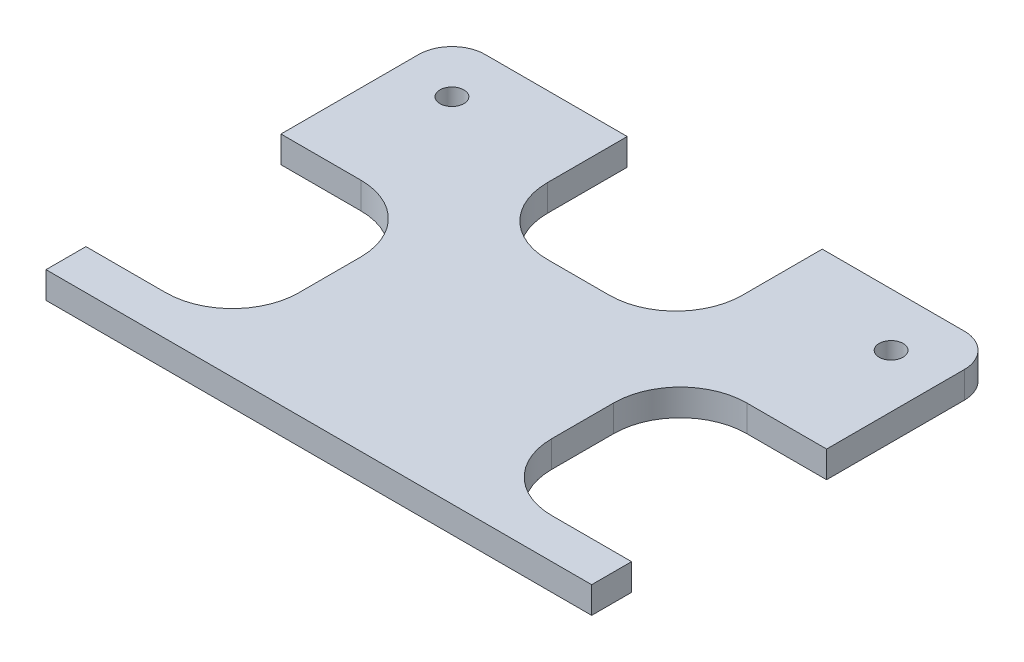
ISO-10303-21;
HEADER;
FILE_DESCRIPTION(('STEP AP214'),'2;1');
FILE_NAME('part.step','',(''),(''),'','','');
FILE_SCHEMA(('AUTOMOTIVE_DESIGN { 1 0 10303 214 1 1 1 1 }'));
ENDSEC;
DATA;
#1=APPLICATION_CONTEXT('core data for automotive mechanical design processes');
#2=APPLICATION_PROTOCOL_DEFINITION('international standard','automotive_design',2000,#1);
#3=PRODUCT_CONTEXT('',#1,'mechanical');
#4=PRODUCT('Part','Part','',(#3));
#5=PRODUCT_RELATED_PRODUCT_CATEGORY('part','',(#4));
#6=PRODUCT_DEFINITION_FORMATION('','',#4);
#7=PRODUCT_DEFINITION_CONTEXT('part definition',#1,'design');
#8=PRODUCT_DEFINITION('design','',#6,#7);
#9=PRODUCT_DEFINITION_SHAPE('','',#8);
#10=(LENGTH_UNIT() NAMED_UNIT(*) SI_UNIT(.MILLI.,.METRE.));
#11=(NAMED_UNIT(*) PLANE_ANGLE_UNIT() SI_UNIT($,.RADIAN.));
#12=(NAMED_UNIT(*) SI_UNIT($,.STERADIAN.) SOLID_ANGLE_UNIT());
#13=UNCERTAINTY_MEASURE_WITH_UNIT(LENGTH_MEASURE(1.E-05),#10,'distance_accuracy_value','');
#14=(GEOMETRIC_REPRESENTATION_CONTEXT(3) GLOBAL_UNCERTAINTY_ASSIGNED_CONTEXT((#13)) GLOBAL_UNIT_ASSIGNED_CONTEXT((#10,
#11,#12)) REPRESENTATION_CONTEXT('',''));
#15=CARTESIAN_POINT('',(0.,0.,0.));
#16=DIRECTION('',(0.,0.,1.));
#17=DIRECTION('',(1.,0.,0.));
#18=AXIS2_PLACEMENT_3D('',#15,#16,#17);
#19=CARTESIAN_POINT('',(0.,4.,0.));
#20=DIRECTION('',(1.,0.,0.));
#21=DIRECTION('',(0.,0.,-1.));
#22=AXIS2_PLACEMENT_3D('',#19,#20,#21);
#23=PLANE('',#22);
#24=DIRECTION('',(0.,0.,1.));
#25=VECTOR('',#24,1.);
#26=CARTESIAN_POINT('',(0.,0.,0.));
#27=LINE('',#26,#25);
#28=CARTESIAN_POINT('',(0.,0.,-56.));
#29=VERTEX_POINT('',#28);
#30=CARTESIAN_POINT('',(0.,0.,-35.307012987013));
#31=VERTEX_POINT('',#30);
#32=EDGE_CURVE('E358',#29,#31,#27,.T.);
#33=ORIENTED_EDGE('',*,*,#32,.T.);
#34=DIRECTION('',(0.,1.,0.));
#35=VECTOR('',#34,1.);
#36=CARTESIAN_POINT('',(0.,0.,-35.307012987013));
#37=LINE('',#36,#35);
#38=CARTESIAN_POINT('',(0.,4.,-35.307012987013));
#39=VERTEX_POINT('',#38);
#40=EDGE_CURVE('E315',#31,#39,#37,.T.);
#41=ORIENTED_EDGE('',*,*,#40,.T.);
#42=DIRECTION('',(0.,0.,1.));
#43=VECTOR('',#42,1.);
#44=CARTESIAN_POINT('',(0.,4.,0.));
#45=LINE('',#44,#43);
#46=CARTESIAN_POINT('',(0.,4.,-56.));
#47=VERTEX_POINT('',#46);
#48=EDGE_CURVE('E344',#47,#39,#45,.T.);
#49=ORIENTED_EDGE('',*,*,#48,.F.);
#50=DIRECTION('',(0.,-1.,0.));
#51=VECTOR('',#50,1.);
#52=CARTESIAN_POINT('',(0.,4.,-56.));
#53=LINE('',#52,#51);
#54=EDGE_CURVE('E231',#47,#29,#53,.T.);
#55=ORIENTED_EDGE('',*,*,#54,.T.);
#56=EDGE_LOOP('',(#33,#41,#49,#55));
#57=FACE_BOUND('',#56,.T.);
#58=ADVANCED_FACE('F33',(#57),#23,.F.);
#59=CARTESIAN_POINT('',(82.,4.,0.));
#60=DIRECTION('',(-1.,0.,0.));
#61=DIRECTION('',(0.,0.,1.));
#62=AXIS2_PLACEMENT_3D('',#59,#60,#61);
#63=PLANE('',#62);
#64=DIRECTION('',(0.,0.,-1.));
#65=VECTOR('',#64,1.);
#66=CARTESIAN_POINT('',(82.,0.,0.));
#67=LINE('',#66,#65);
#68=CARTESIAN_POINT('',(82.,0.,0.));
#69=VERTEX_POINT('',#68);
#70=CARTESIAN_POINT('',(82.,0.,-6.));
#71=VERTEX_POINT('',#70);
#72=EDGE_CURVE('E362',#69,#71,#67,.T.);
#73=ORIENTED_EDGE('',*,*,#72,.T.);
#74=DIRECTION('',(0.,1.,0.));
#75=VECTOR('',#74,1.);
#76=CARTESIAN_POINT('',(82.,0.,-6.));
#77=LINE('',#76,#75);
#78=CARTESIAN_POINT('',(82.,4.,-6.));
#79=VERTEX_POINT('',#78);
#80=EDGE_CURVE('E394',#71,#79,#77,.T.);
#81=ORIENTED_EDGE('',*,*,#80,.T.);
#82=DIRECTION('',(0.,0.,-1.));
#83=VECTOR('',#82,1.);
#84=CARTESIAN_POINT('',(82.,4.,0.));
#85=LINE('',#84,#83);
#86=CARTESIAN_POINT('',(82.,4.,0.));
#87=VERTEX_POINT('',#86);
#88=EDGE_CURVE('E349',#87,#79,#85,.T.);
#89=ORIENTED_EDGE('',*,*,#88,.F.);
#90=DIRECTION('',(0.,-1.,0.));
#91=VECTOR('',#90,1.);
#92=CARTESIAN_POINT('',(82.,4.,0.));
#93=LINE('',#92,#91);
#94=EDGE_CURVE('E242',#87,#69,#93,.T.);
#95=ORIENTED_EDGE('',*,*,#94,.T.);
#96=EDGE_LOOP('',(#73,#81,#89,#95));
#97=FACE_BOUND('',#96,.T.);
#98=ADVANCED_FACE('F417',(#97),#63,.F.);
#99=CARTESIAN_POINT('',(5.00000000000004,4.,-61.));
#100=DIRECTION('',(0.,0.,1.));
#101=DIRECTION('',(1.,0.,0.));
#102=AXIS2_PLACEMENT_3D('',#99,#100,#101);
#103=PLANE('',#102);
#104=DIRECTION('',(-1.,0.,0.));
#105=VECTOR('',#104,1.);
#106=CARTESIAN_POINT('',(5.00000000000004,4.,-61.));
#107=LINE('',#106,#105);
#108=CARTESIAN_POINT('',(26.3464935064935,4.,-61.));
#109=VERTEX_POINT('',#108);
#110=CARTESIAN_POINT('',(5.00000000000004,4.,-61.));
#111=VERTEX_POINT('',#110);
#112=EDGE_CURVE('E354',#109,#111,#107,.T.);
#113=ORIENTED_EDGE('',*,*,#112,.F.);
#114=DIRECTION('',(0.,1.,0.));
#115=VECTOR('',#114,1.);
#116=CARTESIAN_POINT('',(26.3464935064935,0.,-61.));
#117=LINE('',#116,#115);
#118=CARTESIAN_POINT('',(26.3464935064935,0.,-61.));
#119=VERTEX_POINT('',#118);
#120=EDGE_CURVE('E216',#119,#109,#117,.T.);
#121=ORIENTED_EDGE('',*,*,#120,.F.);
#122=DIRECTION('',(-1.,0.,0.));
#123=VECTOR('',#122,1.);
#124=CARTESIAN_POINT('',(5.00000000000004,0.,-61.));
#125=LINE('',#124,#123);
#126=CARTESIAN_POINT('',(5.00000000000004,0.,-61.));
#127=VERTEX_POINT('',#126);
#128=EDGE_CURVE('E223',#119,#127,#125,.T.);
#129=ORIENTED_EDGE('',*,*,#128,.T.);
#130=DIRECTION('',(0.,-1.,0.));
#131=VECTOR('',#130,1.);
#132=CARTESIAN_POINT('',(5.00000000000004,4.,-61.));
#133=LINE('',#132,#131);
#134=EDGE_CURVE('E234',#111,#127,#133,.T.);
#135=ORIENTED_EDGE('',*,*,#134,.F.);
#136=EDGE_LOOP('',(#113,#121,#129,#135));
#137=FACE_BOUND('',#136,.T.);
#138=ADVANCED_FACE('F477',(#137),#103,.F.);
#139=CARTESIAN_POINT('',(5.,4.,-56.));
#140=DIRECTION('',(0.,-1.,0.));
#141=DIRECTION('',(0.,0.,-1.));
#142=AXIS2_PLACEMENT_3D('',#139,#140,#141);
#143=PLANE('',#142);
#144=DIRECTION('',(1.,0.,0.));
#145=VECTOR('',#144,1.);
#146=CARTESIAN_POINT('',(26.3464935064935,4.,-39.));
#147=LINE('',#146,#145);
#148=CARTESIAN_POINT('',(36.3464935064935,4.,-39.));
#149=VERTEX_POINT('',#148);
#150=CARTESIAN_POINT('',(45.6535064935065,4.,-39.));
#151=VERTEX_POINT('',#150);
#152=EDGE_CURVE('E440',#149,#151,#147,.T.);
#153=ORIENTED_EDGE('',*,*,#152,.F.);
#154=CARTESIAN_POINT('',(36.3464935064935,4.,-49.));
#155=DIRECTION('',(0.,-1.,0.));
#156=DIRECTION('',(0.,0.,-1.));
#157=AXIS2_PLACEMENT_3D('',#154,#155,#156);
#158=CIRCLE('',#157,10.);
#159=CARTESIAN_POINT('',(26.3464935064935,4.,-49.));
#160=VERTEX_POINT('',#159);
#161=EDGE_CURVE('E279',#149,#160,#158,.T.);
#162=ORIENTED_EDGE('',*,*,#161,.T.);
#163=DIRECTION('',(0.,0.,1.));
#164=VECTOR('',#163,1.);
#165=CARTESIAN_POINT('',(26.3464935064935,4.,-61.));
#166=LINE('',#165,#164);
#167=EDGE_CURVE('E396',#109,#160,#166,.T.);
#168=ORIENTED_EDGE('',*,*,#167,.F.);
#169=ORIENTED_EDGE('',*,*,#112,.T.);
#170=CARTESIAN_POINT('',(5.,4.,-56.));
#171=DIRECTION('',(0.,1.,0.));
#172=DIRECTION('',(0.,0.,-1.));
#173=AXIS2_PLACEMENT_3D('',#170,#171,#172);
#174=CIRCLE('',#173,5.);
#175=EDGE_CURVE('E235',#111,#47,#174,.T.);
#176=ORIENTED_EDGE('',*,*,#175,.T.);
#177=ORIENTED_EDGE('',*,*,#48,.T.);
#178=DIRECTION('',(-1.,0.,0.));
#179=VECTOR('',#178,1.);
#180=CARTESIAN_POINT('',(0.,4.,-35.307012987013));
#181=LINE('',#180,#179);
#182=CARTESIAN_POINT('',(12.,4.,-35.307012987013));
#183=VERTEX_POINT('',#182);
#184=EDGE_CURVE('E303',#183,#39,#181,.T.);
#185=ORIENTED_EDGE('',*,*,#184,.F.);
#186=CARTESIAN_POINT('',(12.,4.,-25.307012987013));
#187=DIRECTION('',(0.,-1.,0.));
#188=DIRECTION('',(0.,0.,-1.));
#189=AXIS2_PLACEMENT_3D('',#186,#187,#188);
#190=CIRCLE('',#189,10.);
#191=CARTESIAN_POINT('',(22.,4.,-25.307012987013));
#192=VERTEX_POINT('',#191);
#193=EDGE_CURVE('E41',#183,#192,#190,.T.);
#194=ORIENTED_EDGE('',*,*,#193,.T.);
#195=DIRECTION('',(0.,0.,-1.));
#196=VECTOR('',#195,1.);
#197=CARTESIAN_POINT('',(22.,4.,-35.307012987013));
#198=LINE('',#197,#196);
#199=CARTESIAN_POINT('',(22.,4.,-16.));
#200=VERTEX_POINT('',#199);
#201=EDGE_CURVE('E301',#200,#192,#198,.T.);
#202=ORIENTED_EDGE('',*,*,#201,.F.);
#203=CARTESIAN_POINT('',(12.,4.,-16.));
#204=DIRECTION('',(0.,-1.,0.));
#205=DIRECTION('',(0.,0.,-1.));
#206=AXIS2_PLACEMENT_3D('',#203,#204,#205);
#207=CIRCLE('',#206,10.);
#208=CARTESIAN_POINT('',(12.,4.,-6.));
#209=VERTEX_POINT('',#208);
#210=EDGE_CURVE('E291',#200,#209,#207,.T.);
#211=ORIENTED_EDGE('',*,*,#210,.T.);
#212=DIRECTION('',(1.,0.,0.));
#213=VECTOR('',#212,1.);
#214=CARTESIAN_POINT('',(0.,4.,-6.));
#215=LINE('',#214,#213);
#216=CARTESIAN_POINT('',(0.,4.,-6.));
#217=VERTEX_POINT('',#216);
#218=EDGE_CURVE('E308',#217,#209,#215,.T.);
#219=ORIENTED_EDGE('',*,*,#218,.F.);
#220=CARTESIAN_POINT('',(0.,4.,0.));
#221=VERTEX_POINT('',#220);
#222=EDGE_CURVE('E225',#217,#221,#45,.T.);
#223=ORIENTED_EDGE('',*,*,#222,.T.);
#224=DIRECTION('',(1.,0.,0.));
#225=VECTOR('',#224,1.);
#226=CARTESIAN_POINT('',(0.,4.,0.));
#227=LINE('',#226,#225);
#228=EDGE_CURVE('E346',#221,#87,#227,.T.);
#229=ORIENTED_EDGE('',*,*,#228,.T.);
#230=ORIENTED_EDGE('',*,*,#88,.T.);
#231=DIRECTION('',(1.,0.,0.));
#232=VECTOR('',#231,1.);
#233=CARTESIAN_POINT('',(82.,4.,-6.));
#234=LINE('',#233,#232);
#235=CARTESIAN_POINT('',(70.,4.,-6.));
#236=VERTEX_POINT('',#235);
#237=EDGE_CURVE('E386',#236,#79,#234,.T.);
#238=ORIENTED_EDGE('',*,*,#237,.F.);
#239=CARTESIAN_POINT('',(70.,4.,-16.));
#240=DIRECTION('',(0.,-1.,0.));
#241=DIRECTION('',(0.,0.,-1.));
#242=AXIS2_PLACEMENT_3D('',#239,#240,#241);
#243=CIRCLE('',#242,10.);
#244=CARTESIAN_POINT('',(60.,4.,-16.));
#245=VERTEX_POINT('',#244);
#246=EDGE_CURVE('E283',#236,#245,#243,.T.);
#247=ORIENTED_EDGE('',*,*,#246,.T.);
#248=DIRECTION('',(0.,0.,1.));
#249=VECTOR('',#248,1.);
#250=CARTESIAN_POINT('',(60.,4.,-35.307012987013));
#251=LINE('',#250,#249);
#252=CARTESIAN_POINT('',(60.,4.,-25.307012987013));
#253=VERTEX_POINT('',#252);
#254=EDGE_CURVE('E383',#253,#245,#251,.T.);
#255=ORIENTED_EDGE('',*,*,#254,.F.);
#256=CARTESIAN_POINT('',(70.,4.,-25.307012987013));
#257=DIRECTION('',(0.,-1.,0.));
#258=DIRECTION('',(0.,0.,-1.));
#259=AXIS2_PLACEMENT_3D('',#256,#257,#258);
#260=CIRCLE('',#259,10.);
#261=CARTESIAN_POINT('',(70.,4.,-35.307012987013));
#262=VERTEX_POINT('',#261);
#263=EDGE_CURVE('E287',#253,#262,#260,.T.);
#264=ORIENTED_EDGE('',*,*,#263,.T.);
#265=DIRECTION('',(-1.,0.,0.));
#266=VECTOR('',#265,1.);
#267=CARTESIAN_POINT('',(82.,4.,-35.307012987013));
#268=LINE('',#267,#266);
#269=CARTESIAN_POINT('',(82.,4.,-35.307012987013));
#270=VERTEX_POINT('',#269);
#271=EDGE_CURVE('E329',#270,#262,#268,.T.);
#272=ORIENTED_EDGE('',*,*,#271,.F.);
#273=CARTESIAN_POINT('',(82.,4.,-56.));
#274=VERTEX_POINT('',#273);
#275=EDGE_CURVE('E348',#270,#274,#85,.T.);
#276=ORIENTED_EDGE('',*,*,#275,.T.);
#277=CARTESIAN_POINT('',(77.,4.,-56.));
#278=DIRECTION('',(0.,1.,0.));
#279=DIRECTION('',(0.,0.,1.));
#280=AXIS2_PLACEMENT_3D('',#277,#278,#279);
#281=CIRCLE('',#280,5.);
#282=CARTESIAN_POINT('',(77.,4.,-61.));
#283=VERTEX_POINT('',#282);
#284=EDGE_CURVE('E352',#274,#283,#281,.T.);
#285=ORIENTED_EDGE('',*,*,#284,.T.);
#286=CARTESIAN_POINT('',(55.6535064935065,4.,-61.));
#287=VERTEX_POINT('',#286);
#288=EDGE_CURVE('E355',#283,#287,#107,.T.);
#289=ORIENTED_EDGE('',*,*,#288,.T.);
#290=DIRECTION('',(0.,0.,-1.));
#291=VECTOR('',#290,1.);
#292=CARTESIAN_POINT('',(55.6535064935065,4.,-61.));
#293=LINE('',#292,#291);
#294=CARTESIAN_POINT('',(55.6535064935065,4.,-49.));
#295=VERTEX_POINT('',#294);
#296=EDGE_CURVE('E212',#295,#287,#293,.T.);
#297=ORIENTED_EDGE('',*,*,#296,.F.);
#298=CARTESIAN_POINT('',(45.6535064935065,4.,-49.));
#299=DIRECTION('',(0.,-1.,0.));
#300=DIRECTION('',(0.,0.,-1.));
#301=AXIS2_PLACEMENT_3D('',#298,#299,#300);
#302=CIRCLE('',#301,10.);
#303=EDGE_CURVE('E276',#295,#151,#302,.T.);
#304=ORIENTED_EDGE('',*,*,#303,.T.);
#305=EDGE_LOOP('',(#153,#162,#168,#169,#176,#177,#185,#194,#202,#211,#219,#223,#229,#230,#238,
#247,#255,#264,#272,#276,#285,#289,#297,#304));
#306=FACE_BOUND('',#305,.T.);
#307=CARTESIAN_POINT('',(8.00000000000001,4.,-53.));
#308=DIRECTION('',(0.,1.,0.));
#309=DIRECTION('',(0.,0.,1.));
#310=AXIS2_PLACEMENT_3D('',#307,#308,#309);
#311=CIRCLE('',#310,1.8);
#312=CARTESIAN_POINT('',(8.00000000000001,4.,-51.2));
#313=VERTEX_POINT('',#312);
#314=EDGE_CURVE('E338',#313,#313,#311,.T.);
#315=ORIENTED_EDGE('',*,*,#314,.F.);
#316=EDGE_LOOP('',(#315));
#317=FACE_BOUND('',#316,.T.);
#318=CARTESIAN_POINT('',(74.,4.,-53.));
#319=DIRECTION('',(0.,1.,0.));
#320=DIRECTION('',(0.,0.,1.));
#321=AXIS2_PLACEMENT_3D('',#318,#319,#320);
#322=CIRCLE('',#321,1.79999999999999);
#323=CARTESIAN_POINT('',(74.,4.,-51.2));
#324=VERTEX_POINT('',#323);
#325=EDGE_CURVE('E331',#324,#324,#322,.T.);
#326=ORIENTED_EDGE('',*,*,#325,.F.);
#327=EDGE_LOOP('',(#326));
#328=FACE_BOUND('',#327,.T.);
#329=ADVANCED_FACE('F299',(#306,#317,#328),#143,.F.);
#330=CARTESIAN_POINT('',(5.,0.,-56.));
#331=DIRECTION('',(0.,-1.,0.));
#332=DIRECTION('',(0.,0.,-1.));
#333=AXIS2_PLACEMENT_3D('',#330,#331,#332);
#334=PLANE('',#333);
#335=DIRECTION('',(0.,0.,1.));
#336=VECTOR('',#335,1.);
#337=CARTESIAN_POINT('',(26.3464935064935,0.,-61.));
#338=LINE('',#337,#336);
#339=CARTESIAN_POINT('',(26.3464935064935,0.,-49.));
#340=VERTEX_POINT('',#339);
#341=EDGE_CURVE('E439',#119,#340,#338,.T.);
#342=ORIENTED_EDGE('',*,*,#341,.T.);
#343=CARTESIAN_POINT('',(36.3464935064935,0.,-49.));
#344=DIRECTION('',(0.,-1.,0.));
#345=DIRECTION('',(0.,0.,-1.));
#346=AXIS2_PLACEMENT_3D('',#343,#344,#345);
#347=CIRCLE('',#346,10.);
#348=CARTESIAN_POINT('',(36.3464935064935,0.,-39.));
#349=VERTEX_POINT('',#348);
#350=EDGE_CURVE('E281',#340,#349,#347,.F.);
#351=ORIENTED_EDGE('',*,*,#350,.T.);
#352=DIRECTION('',(1.,0.,0.));
#353=VECTOR('',#352,1.);
#354=CARTESIAN_POINT('',(26.3464935064935,0.,-39.));
#355=LINE('',#354,#353);
#356=CARTESIAN_POINT('',(45.6535064935065,0.,-39.));
#357=VERTEX_POINT('',#356);
#358=EDGE_CURVE('E207',#349,#357,#355,.T.);
#359=ORIENTED_EDGE('',*,*,#358,.T.);
#360=CARTESIAN_POINT('',(45.6535064935065,0.,-49.));
#361=DIRECTION('',(0.,-1.,0.));
#362=DIRECTION('',(0.,0.,-1.));
#363=AXIS2_PLACEMENT_3D('',#360,#361,#362);
#364=CIRCLE('',#363,10.);
#365=CARTESIAN_POINT('',(55.6535064935065,0.,-49.));
#366=VERTEX_POINT('',#365);
#367=EDGE_CURVE('E202',#357,#366,#364,.F.);
#368=ORIENTED_EDGE('',*,*,#367,.T.);
#369=DIRECTION('',(0.,0.,-1.));
#370=VECTOR('',#369,1.);
#371=CARTESIAN_POINT('',(55.6535064935065,0.,-61.));
#372=LINE('',#371,#370);
#373=CARTESIAN_POINT('',(55.6535064935065,0.,-61.));
#374=VERTEX_POINT('',#373);
#375=EDGE_CURVE('E192',#366,#374,#372,.T.);
#376=ORIENTED_EDGE('',*,*,#375,.T.);
#377=CARTESIAN_POINT('',(77.,0.,-61.));
#378=VERTEX_POINT('',#377);
#379=EDGE_CURVE('E199',#378,#374,#125,.T.);
#380=ORIENTED_EDGE('',*,*,#379,.F.);
#381=CARTESIAN_POINT('',(77.,0.,-56.));
#382=DIRECTION('',(0.,1.,0.));
#383=DIRECTION('',(0.,0.,1.));
#384=AXIS2_PLACEMENT_3D('',#381,#382,#383);
#385=CIRCLE('',#384,5.);
#386=CARTESIAN_POINT('',(82.,0.,-56.));
#387=VERTEX_POINT('',#386);
#388=EDGE_CURVE('E227',#387,#378,#385,.T.);
#389=ORIENTED_EDGE('',*,*,#388,.F.);
#390=CARTESIAN_POINT('',(82.,0.,-35.307012987013));
#391=VERTEX_POINT('',#390);
#392=EDGE_CURVE('E361',#391,#387,#67,.T.);
#393=ORIENTED_EDGE('',*,*,#392,.F.);
#394=DIRECTION('',(-1.,0.,0.));
#395=VECTOR('',#394,1.);
#396=CARTESIAN_POINT('',(82.,0.,-35.307012987013));
#397=LINE('',#396,#395);
#398=CARTESIAN_POINT('',(70.,0.,-35.307012987013));
#399=VERTEX_POINT('',#398);
#400=EDGE_CURVE('E393',#391,#399,#397,.T.);
#401=ORIENTED_EDGE('',*,*,#400,.T.);
#402=CARTESIAN_POINT('',(70.,0.,-25.307012987013));
#403=DIRECTION('',(0.,-1.,0.));
#404=DIRECTION('',(0.,0.,-1.));
#405=AXIS2_PLACEMENT_3D('',#402,#403,#404);
#406=CIRCLE('',#405,10.);
#407=CARTESIAN_POINT('',(60.,0.,-25.307012987013));
#408=VERTEX_POINT('',#407);
#409=EDGE_CURVE('E289',#399,#408,#406,.F.);
#410=ORIENTED_EDGE('',*,*,#409,.T.);
#411=DIRECTION('',(0.,0.,1.));
#412=VECTOR('',#411,1.);
#413=CARTESIAN_POINT('',(60.,0.,-35.307012987013));
#414=LINE('',#413,#412);
#415=CARTESIAN_POINT('',(60.,0.,-16.));
#416=VERTEX_POINT('',#415);
#417=EDGE_CURVE('E432',#408,#416,#414,.T.);
#418=ORIENTED_EDGE('',*,*,#417,.T.);
#419=CARTESIAN_POINT('',(70.,0.,-16.));
#420=DIRECTION('',(0.,-1.,0.));
#421=DIRECTION('',(0.,0.,-1.));
#422=AXIS2_PLACEMENT_3D('',#419,#420,#421);
#423=CIRCLE('',#422,10.);
#424=CARTESIAN_POINT('',(70.,0.,-6.));
#425=VERTEX_POINT('',#424);
#426=EDGE_CURVE('E285',#416,#425,#423,.F.);
#427=ORIENTED_EDGE('',*,*,#426,.T.);
#428=DIRECTION('',(1.,0.,0.));
#429=VECTOR('',#428,1.);
#430=CARTESIAN_POINT('',(82.,0.,-6.));
#431=LINE('',#430,#429);
#432=EDGE_CURVE('E389',#425,#71,#431,.T.);
#433=ORIENTED_EDGE('',*,*,#432,.T.);
#434=ORIENTED_EDGE('',*,*,#72,.F.);
#435=DIRECTION('',(1.,0.,0.));
#436=VECTOR('',#435,1.);
#437=CARTESIAN_POINT('',(0.,0.,0.));
#438=LINE('',#437,#436);
#439=CARTESIAN_POINT('',(0.,0.,0.));
#440=VERTEX_POINT('',#439);
#441=EDGE_CURVE('E360',#440,#69,#438,.T.);
#442=ORIENTED_EDGE('',*,*,#441,.F.);
#443=CARTESIAN_POINT('',(0.,0.,-6.));
#444=VERTEX_POINT('',#443);
#445=EDGE_CURVE('E341',#444,#440,#27,.T.);
#446=ORIENTED_EDGE('',*,*,#445,.F.);
#447=DIRECTION('',(1.,0.,0.));
#448=VECTOR('',#447,1.);
#449=CARTESIAN_POINT('',(0.,0.,-6.));
#450=LINE('',#449,#448);
#451=CARTESIAN_POINT('',(12.,0.,-6.));
#452=VERTEX_POINT('',#451);
#453=EDGE_CURVE('E322',#444,#452,#450,.T.);
#454=ORIENTED_EDGE('',*,*,#453,.T.);
#455=CARTESIAN_POINT('',(12.,0.,-16.));
#456=DIRECTION('',(0.,-1.,0.));
#457=DIRECTION('',(0.,0.,-1.));
#458=AXIS2_PLACEMENT_3D('',#455,#456,#457);
#459=CIRCLE('',#458,10.);
#460=CARTESIAN_POINT('',(22.,0.,-16.));
#461=VERTEX_POINT('',#460);
#462=EDGE_CURVE('E293',#452,#461,#459,.F.);
#463=ORIENTED_EDGE('',*,*,#462,.T.);
#464=DIRECTION('',(0.,0.,-1.));
#465=VECTOR('',#464,1.);
#466=CARTESIAN_POINT('',(22.,0.,-35.307012987013));
#467=LINE('',#466,#465);
#468=CARTESIAN_POINT('',(22.,0.,-25.307012987013));
#469=VERTEX_POINT('',#468);
#470=EDGE_CURVE('E319',#461,#469,#467,.T.);
#471=ORIENTED_EDGE('',*,*,#470,.T.);
#472=CARTESIAN_POINT('',(12.,0.,-25.307012987013));
#473=DIRECTION('',(0.,-1.,0.));
#474=DIRECTION('',(0.,0.,-1.));
#475=AXIS2_PLACEMENT_3D('',#472,#473,#474);
#476=CIRCLE('',#475,10.);
#477=CARTESIAN_POINT('',(12.,0.,-35.307012987013));
#478=VERTEX_POINT('',#477);
#479=EDGE_CURVE('E11',#469,#478,#476,.F.);
#480=ORIENTED_EDGE('',*,*,#479,.T.);
#481=DIRECTION('',(-1.,0.,0.));
#482=VECTOR('',#481,1.);
#483=CARTESIAN_POINT('',(0.,0.,-35.307012987013));
#484=LINE('',#483,#482);
#485=EDGE_CURVE('E314',#478,#31,#484,.T.);
#486=ORIENTED_EDGE('',*,*,#485,.T.);
#487=ORIENTED_EDGE('',*,*,#32,.F.);
#488=CARTESIAN_POINT('',(5.,0.,-56.));
#489=DIRECTION('',(0.,1.,0.));
#490=DIRECTION('',(0.,0.,-1.));
#491=AXIS2_PLACEMENT_3D('',#488,#489,#490);
#492=CIRCLE('',#491,5.);
#493=EDGE_CURVE('E222',#127,#29,#492,.T.);
#494=ORIENTED_EDGE('',*,*,#493,.F.);
#495=ORIENTED_EDGE('',*,*,#128,.F.);
#496=EDGE_LOOP('',(#342,#351,#359,#368,#376,#380,#389,#393,#401,#410,#418,#427,#433,#434,#442,
#446,#454,#463,#471,#480,#486,#487,#494,#495));
#497=FACE_BOUND('',#496,.T.);
#498=CARTESIAN_POINT('',(8.00000000000001,0.,-53.));
#499=DIRECTION('',(0.,1.,0.));
#500=DIRECTION('',(0.,0.,1.));
#501=AXIS2_PLACEMENT_3D('',#498,#499,#500);
#502=CIRCLE('',#501,1.8);
#503=CARTESIAN_POINT('',(8.00000000000001,0.,-51.2));
#504=VERTEX_POINT('',#503);
#505=EDGE_CURVE('E334',#504,#504,#502,.T.);
#506=ORIENTED_EDGE('',*,*,#505,.T.);
#507=EDGE_LOOP('',(#506));
#508=FACE_BOUND('',#507,.T.);
#509=CARTESIAN_POINT('',(74.,0.,-53.));
#510=DIRECTION('',(0.,1.,0.));
#511=DIRECTION('',(0.,0.,1.));
#512=AXIS2_PLACEMENT_3D('',#509,#510,#511);
#513=CIRCLE('',#512,1.79999999999999);
#514=CARTESIAN_POINT('',(74.,0.,-51.2));
#515=VERTEX_POINT('',#514);
#516=EDGE_CURVE('E335',#515,#515,#513,.T.);
#517=ORIENTED_EDGE('',*,*,#516,.T.);
#518=EDGE_LOOP('',(#517));
#519=FACE_BOUND('',#518,.T.);
#520=ADVANCED_FACE('F195',(#497,#508,#519),#334,.T.);
#521=ORIENTED_EDGE('',*,*,#222,.F.);
#522=DIRECTION('',(0.,1.,0.));
#523=VECTOR('',#522,1.);
#524=CARTESIAN_POINT('',(0.,0.,-6.));
#525=LINE('',#524,#523);
#526=EDGE_CURVE('E318',#444,#217,#525,.T.);
#527=ORIENTED_EDGE('',*,*,#526,.F.);
#528=ORIENTED_EDGE('',*,*,#445,.T.);
#529=DIRECTION('',(0.,-1.,0.));
#530=VECTOR('',#529,1.);
#531=CARTESIAN_POINT('',(0.,4.,0.));
#532=LINE('',#531,#530);
#533=EDGE_CURVE('E245',#221,#440,#532,.T.);
#534=ORIENTED_EDGE('',*,*,#533,.F.);
#535=EDGE_LOOP('',(#521,#527,#528,#534));
#536=FACE_BOUND('',#535,.T.);
#537=ADVANCED_FACE('F410',(#536),#23,.F.);
#538=CARTESIAN_POINT('',(0.,4.,0.));
#539=DIRECTION('',(0.,0.,-1.));
#540=DIRECTION('',(-1.,0.,0.));
#541=AXIS2_PLACEMENT_3D('',#538,#539,#540);
#542=PLANE('',#541);
#543=ORIENTED_EDGE('',*,*,#441,.T.);
#544=ORIENTED_EDGE('',*,*,#94,.F.);
#545=ORIENTED_EDGE('',*,*,#228,.F.);
#546=ORIENTED_EDGE('',*,*,#533,.T.);
#547=EDGE_LOOP('',(#543,#544,#545,#546));
#548=FACE_BOUND('',#547,.T.);
#549=ADVANCED_FACE('F415',(#548),#542,.F.);
#550=ORIENTED_EDGE('',*,*,#275,.F.);
#551=DIRECTION('',(0.,1.,0.));
#552=VECTOR('',#551,1.);
#553=CARTESIAN_POINT('',(82.,0.,-35.307012987013));
#554=LINE('',#553,#552);
#555=EDGE_CURVE('E374',#391,#270,#554,.T.);
#556=ORIENTED_EDGE('',*,*,#555,.F.);
#557=ORIENTED_EDGE('',*,*,#392,.T.);
#558=DIRECTION('',(0.,-1.,0.));
#559=VECTOR('',#558,1.);
#560=CARTESIAN_POINT('',(82.,4.,-56.));
#561=LINE('',#560,#559);
#562=EDGE_CURVE('E239',#274,#387,#561,.T.);
#563=ORIENTED_EDGE('',*,*,#562,.F.);
#564=EDGE_LOOP('',(#550,#556,#557,#563));
#565=FACE_BOUND('',#564,.T.);
#566=ADVANCED_FACE('F372',(#565),#63,.F.);
#567=CARTESIAN_POINT('',(77.,4.,-56.));
#568=DIRECTION('',(0.,-1.,0.));
#569=DIRECTION('',(0.,0.,-1.));
#570=AXIS2_PLACEMENT_3D('',#567,#568,#569);
#571=CYLINDRICAL_SURFACE('',#570,5.);
#572=ORIENTED_EDGE('',*,*,#388,.T.);
#573=DIRECTION('',(0.,-1.,0.));
#574=VECTOR('',#573,1.);
#575=CARTESIAN_POINT('',(77.,4.,-61.));
#576=LINE('',#575,#574);
#577=EDGE_CURVE('E221',#283,#378,#576,.T.);
#578=ORIENTED_EDGE('',*,*,#577,.F.);
#579=ORIENTED_EDGE('',*,*,#284,.F.);
#580=ORIENTED_EDGE('',*,*,#562,.T.);
#581=EDGE_LOOP('',(#572,#578,#579,#580));
#582=FACE_BOUND('',#581,.T.);
#583=ADVANCED_FACE('F377',(#582),#571,.T.);
#584=ORIENTED_EDGE('',*,*,#379,.T.);
#585=DIRECTION('',(0.,1.,0.));
#586=VECTOR('',#585,1.);
#587=CARTESIAN_POINT('',(55.6535064935065,0.,-61.));
#588=LINE('',#587,#586);
#589=EDGE_CURVE('E206',#374,#287,#588,.T.);
#590=ORIENTED_EDGE('',*,*,#589,.T.);
#591=ORIENTED_EDGE('',*,*,#288,.F.);
#592=ORIENTED_EDGE('',*,*,#577,.T.);
#593=EDGE_LOOP('',(#584,#590,#591,#592));
#594=FACE_BOUND('',#593,.T.);
#595=ADVANCED_FACE('F219',(#594),#103,.F.);
#596=CARTESIAN_POINT('',(5.,4.,-56.));
#597=DIRECTION('',(0.,-1.,0.));
#598=DIRECTION('',(0.,0.,-1.));
#599=AXIS2_PLACEMENT_3D('',#596,#597,#598);
#600=CYLINDRICAL_SURFACE('',#599,5.);
#601=ORIENTED_EDGE('',*,*,#493,.T.);
#602=ORIENTED_EDGE('',*,*,#54,.F.);
#603=ORIENTED_EDGE('',*,*,#175,.F.);
#604=ORIENTED_EDGE('',*,*,#134,.T.);
#605=EDGE_LOOP('',(#601,#602,#603,#604));
#606=FACE_BOUND('',#605,.T.);
#607=ADVANCED_FACE('F495',(#606),#600,.T.);
#608=CARTESIAN_POINT('',(8.00000000000001,4.,-53.));
#609=DIRECTION('',(0.,-1.,0.));
#610=DIRECTION('',(0.,0.,-1.));
#611=AXIS2_PLACEMENT_3D('',#608,#609,#610);
#612=CYLINDRICAL_SURFACE('',#611,1.8);
#613=ORIENTED_EDGE('',*,*,#314,.T.);
#614=EDGE_LOOP('',(#613));
#615=FACE_BOUND('',#614,.T.);
#616=ORIENTED_EDGE('',*,*,#505,.F.);
#617=EDGE_LOOP('',(#616));
#618=FACE_BOUND('',#617,.T.);
#619=ADVANCED_FACE('F498',(#615,#618),#612,.F.);
#620=CARTESIAN_POINT('',(74.,4.,-53.));
#621=DIRECTION('',(0.,-1.,0.));
#622=DIRECTION('',(0.,0.,-1.));
#623=AXIS2_PLACEMENT_3D('',#620,#621,#622);
#624=CYLINDRICAL_SURFACE('',#623,1.79999999999999);
#625=ORIENTED_EDGE('',*,*,#325,.T.);
#626=EDGE_LOOP('',(#625));
#627=FACE_BOUND('',#626,.T.);
#628=ORIENTED_EDGE('',*,*,#516,.F.);
#629=EDGE_LOOP('',(#628));
#630=FACE_BOUND('',#629,.T.);
#631=ADVANCED_FACE('F547',(#627,#630),#624,.F.);
#632=CARTESIAN_POINT('',(26.3464935064935,0.,-61.));
#633=DIRECTION('',(-1.,0.,0.));
#634=DIRECTION('',(0.,0.,1.));
#635=AXIS2_PLACEMENT_3D('',#632,#633,#634);
#636=PLANE('',#635);
#637=ORIENTED_EDGE('',*,*,#167,.T.);
#638=DIRECTION('',(0.,1.,0.));
#639=VECTOR('',#638,1.);
#640=CARTESIAN_POINT('',(26.3464935064935,0.,-49.));
#641=LINE('',#640,#639);
#642=EDGE_CURVE('E255',#160,#340,#641,.F.);
#643=ORIENTED_EDGE('',*,*,#642,.T.);
#644=ORIENTED_EDGE('',*,*,#341,.F.);
#645=ORIENTED_EDGE('',*,*,#120,.T.);
#646=EDGE_LOOP('',(#637,#643,#644,#645));
#647=FACE_BOUND('',#646,.T.);
#648=ADVANCED_FACE('F555',(#647),#636,.F.);
#649=CARTESIAN_POINT('',(55.6535064935065,0.,-61.));
#650=DIRECTION('',(1.,0.,0.));
#651=DIRECTION('',(0.,0.,-1.));
#652=AXIS2_PLACEMENT_3D('',#649,#650,#651);
#653=PLANE('',#652);
#654=ORIENTED_EDGE('',*,*,#375,.F.);
#655=DIRECTION('',(0.,1.,0.));
#656=VECTOR('',#655,1.);
#657=CARTESIAN_POINT('',(55.6535064935065,4.,-49.));
#658=LINE('',#657,#656);
#659=EDGE_CURVE('E248',#366,#295,#658,.T.);
#660=ORIENTED_EDGE('',*,*,#659,.T.);
#661=ORIENTED_EDGE('',*,*,#296,.T.);
#662=ORIENTED_EDGE('',*,*,#589,.F.);
#663=EDGE_LOOP('',(#654,#660,#661,#662));
#664=FACE_BOUND('',#663,.T.);
#665=ADVANCED_FACE('F210',(#664),#653,.F.);
#666=CARTESIAN_POINT('',(26.3464935064935,0.,-39.));
#667=DIRECTION('',(0.,0.,1.));
#668=DIRECTION('',(1.,0.,0.));
#669=AXIS2_PLACEMENT_3D('',#666,#667,#668);
#670=PLANE('',#669);
#671=ORIENTED_EDGE('',*,*,#152,.T.);
#672=DIRECTION('',(0.,1.,0.));
#673=VECTOR('',#672,1.);
#674=CARTESIAN_POINT('',(45.6535064935065,0.,-39.));
#675=LINE('',#674,#673);
#676=EDGE_CURVE('E253',#151,#357,#675,.F.);
#677=ORIENTED_EDGE('',*,*,#676,.T.);
#678=ORIENTED_EDGE('',*,*,#358,.F.);
#679=DIRECTION('',(0.,1.,0.));
#680=VECTOR('',#679,1.);
#681=CARTESIAN_POINT('',(36.3464935064935,4.,-39.));
#682=LINE('',#681,#680);
#683=EDGE_CURVE('E250',#349,#149,#682,.T.);
#684=ORIENTED_EDGE('',*,*,#683,.T.);
#685=EDGE_LOOP('',(#671,#677,#678,#684));
#686=FACE_BOUND('',#685,.T.);
#687=ADVANCED_FACE('F457',(#686),#670,.F.);
#688=CARTESIAN_POINT('',(82.,0.,-6.));
#689=DIRECTION('',(0.,0.,1.));
#690=DIRECTION('',(1.,0.,0.));
#691=AXIS2_PLACEMENT_3D('',#688,#689,#690);
#692=PLANE('',#691);
#693=ORIENTED_EDGE('',*,*,#432,.F.);
#694=DIRECTION('',(0.,1.,0.));
#695=VECTOR('',#694,1.);
#696=CARTESIAN_POINT('',(70.,4.,-6.));
#697=LINE('',#696,#695);
#698=EDGE_CURVE('E257',#425,#236,#697,.T.);
#699=ORIENTED_EDGE('',*,*,#698,.T.);
#700=ORIENTED_EDGE('',*,*,#237,.T.);
#701=ORIENTED_EDGE('',*,*,#80,.F.);
#702=EDGE_LOOP('',(#693,#699,#700,#701));
#703=FACE_BOUND('',#702,.T.);
#704=ADVANCED_FACE('F422',(#703),#692,.F.);
#705=CARTESIAN_POINT('',(60.,0.,-35.307012987013));
#706=DIRECTION('',(-1.,0.,0.));
#707=DIRECTION('',(0.,0.,1.));
#708=AXIS2_PLACEMENT_3D('',#705,#706,#707);
#709=PLANE('',#708);
#710=ORIENTED_EDGE('',*,*,#254,.T.);
#711=DIRECTION('',(0.,1.,0.));
#712=VECTOR('',#711,1.);
#713=CARTESIAN_POINT('',(60.,0.,-16.));
#714=LINE('',#713,#712);
#715=EDGE_CURVE('E263',#245,#416,#714,.F.);
#716=ORIENTED_EDGE('',*,*,#715,.T.);
#717=ORIENTED_EDGE('',*,*,#417,.F.);
#718=DIRECTION('',(0.,1.,0.));
#719=VECTOR('',#718,1.);
#720=CARTESIAN_POINT('',(60.,4.,-25.307012987013));
#721=LINE('',#720,#719);
#722=EDGE_CURVE('E260',#408,#253,#721,.T.);
#723=ORIENTED_EDGE('',*,*,#722,.T.);
#724=EDGE_LOOP('',(#710,#716,#717,#723));
#725=FACE_BOUND('',#724,.T.);
#726=ADVANCED_FACE('F431',(#725),#709,.F.);
#727=CARTESIAN_POINT('',(82.,0.,-35.307012987013));
#728=DIRECTION('',(0.,0.,-1.));
#729=DIRECTION('',(-1.,0.,0.));
#730=AXIS2_PLACEMENT_3D('',#727,#728,#729);
#731=PLANE('',#730);
#732=ORIENTED_EDGE('',*,*,#271,.T.);
#733=DIRECTION('',(0.,1.,0.));
#734=VECTOR('',#733,1.);
#735=CARTESIAN_POINT('',(70.,0.,-35.307012987013));
#736=LINE('',#735,#734);
#737=EDGE_CURVE('E265',#262,#399,#736,.F.);
#738=ORIENTED_EDGE('',*,*,#737,.T.);
#739=ORIENTED_EDGE('',*,*,#400,.F.);
#740=ORIENTED_EDGE('',*,*,#555,.T.);
#741=EDGE_LOOP('',(#732,#738,#739,#740));
#742=FACE_BOUND('',#741,.T.);
#743=ADVANCED_FACE('F603',(#742),#731,.F.);
#744=CARTESIAN_POINT('',(0.,0.,-35.307012987013));
#745=DIRECTION('',(0.,0.,-1.));
#746=DIRECTION('',(-1.,0.,0.));
#747=AXIS2_PLACEMENT_3D('',#744,#745,#746);
#748=PLANE('',#747);
#749=ORIENTED_EDGE('',*,*,#485,.F.);
#750=DIRECTION('',(0.,1.,0.));
#751=VECTOR('',#750,1.);
#752=CARTESIAN_POINT('',(12.,4.,-35.307012987013));
#753=LINE('',#752,#751);
#754=EDGE_CURVE('E274',#478,#183,#753,.T.);
#755=ORIENTED_EDGE('',*,*,#754,.T.);
#756=ORIENTED_EDGE('',*,*,#184,.T.);
#757=ORIENTED_EDGE('',*,*,#40,.F.);
#758=EDGE_LOOP('',(#749,#755,#756,#757));
#759=FACE_BOUND('',#758,.T.);
#760=ADVANCED_FACE('F311',(#759),#748,.F.);
#761=CARTESIAN_POINT('',(22.,0.,-35.307012987013));
#762=DIRECTION('',(1.,0.,0.));
#763=DIRECTION('',(0.,0.,-1.));
#764=AXIS2_PLACEMENT_3D('',#761,#762,#763);
#765=PLANE('',#764);
#766=ORIENTED_EDGE('',*,*,#470,.F.);
#767=DIRECTION('',(0.,1.,0.));
#768=VECTOR('',#767,1.);
#769=CARTESIAN_POINT('',(22.,4.,-16.));
#770=LINE('',#769,#768);
#771=EDGE_CURVE('E269',#461,#200,#770,.T.);
#772=ORIENTED_EDGE('',*,*,#771,.T.);
#773=ORIENTED_EDGE('',*,*,#201,.T.);
#774=DIRECTION('',(0.,1.,0.));
#775=VECTOR('',#774,1.);
#776=CARTESIAN_POINT('',(22.,0.,-25.307012987013));
#777=LINE('',#776,#775);
#778=EDGE_CURVE('E267',#192,#469,#777,.F.);
#779=ORIENTED_EDGE('',*,*,#778,.T.);
#780=EDGE_LOOP('',(#766,#772,#773,#779));
#781=FACE_BOUND('',#780,.T.);
#782=ADVANCED_FACE('F306',(#781),#765,.F.);
#783=CARTESIAN_POINT('',(0.,0.,-6.));
#784=DIRECTION('',(0.,0.,1.));
#785=DIRECTION('',(1.,0.,0.));
#786=AXIS2_PLACEMENT_3D('',#783,#784,#785);
#787=PLANE('',#786);
#788=ORIENTED_EDGE('',*,*,#218,.T.);
#789=DIRECTION('',(0.,1.,0.));
#790=VECTOR('',#789,1.);
#791=CARTESIAN_POINT('',(12.,0.,-6.));
#792=LINE('',#791,#790);
#793=EDGE_CURVE('E272',#209,#452,#792,.F.);
#794=ORIENTED_EDGE('',*,*,#793,.T.);
#795=ORIENTED_EDGE('',*,*,#453,.F.);
#796=ORIENTED_EDGE('',*,*,#526,.T.);
#797=EDGE_LOOP('',(#788,#794,#795,#796));
#798=FACE_BOUND('',#797,.T.);
#799=ADVANCED_FACE('F408',(#798),#787,.F.);
#800=CARTESIAN_POINT('',(45.6535064935065,0.,-49.));
#801=DIRECTION('',(0.,-1.,0.));
#802=DIRECTION('',(0.,0.,-1.));
#803=AXIS2_PLACEMENT_3D('',#800,#801,#802);
#804=CYLINDRICAL_SURFACE('',#803,10.);
#805=ORIENTED_EDGE('',*,*,#367,.F.);
#806=ORIENTED_EDGE('',*,*,#676,.F.);
#807=ORIENTED_EDGE('',*,*,#303,.F.);
#808=ORIENTED_EDGE('',*,*,#659,.F.);
#809=EDGE_LOOP('',(#805,#806,#807,#808));
#810=FACE_BOUND('',#809,.T.);
#811=ADVANCED_FACE('F461',(#810),#804,.F.);
#812=CARTESIAN_POINT('',(36.3464935064935,0.,-49.));
#813=DIRECTION('',(0.,-1.,0.));
#814=DIRECTION('',(0.,0.,-1.));
#815=AXIS2_PLACEMENT_3D('',#812,#813,#814);
#816=CYLINDRICAL_SURFACE('',#815,10.);
#817=ORIENTED_EDGE('',*,*,#350,.F.);
#818=ORIENTED_EDGE('',*,*,#642,.F.);
#819=ORIENTED_EDGE('',*,*,#161,.F.);
#820=ORIENTED_EDGE('',*,*,#683,.F.);
#821=EDGE_LOOP('',(#817,#818,#819,#820));
#822=FACE_BOUND('',#821,.T.);
#823=ADVANCED_FACE('F455',(#822),#816,.F.);
#824=CARTESIAN_POINT('',(70.,0.,-16.));
#825=DIRECTION('',(0.,-1.,0.));
#826=DIRECTION('',(0.,0.,-1.));
#827=AXIS2_PLACEMENT_3D('',#824,#825,#826);
#828=CYLINDRICAL_SURFACE('',#827,10.);
#829=ORIENTED_EDGE('',*,*,#426,.F.);
#830=ORIENTED_EDGE('',*,*,#715,.F.);
#831=ORIENTED_EDGE('',*,*,#246,.F.);
#832=ORIENTED_EDGE('',*,*,#698,.F.);
#833=EDGE_LOOP('',(#829,#830,#831,#832));
#834=FACE_BOUND('',#833,.T.);
#835=ADVANCED_FACE('F426',(#834),#828,.F.);
#836=CARTESIAN_POINT('',(70.,0.,-25.307012987013));
#837=DIRECTION('',(0.,-1.,0.));
#838=DIRECTION('',(0.,0.,-1.));
#839=AXIS2_PLACEMENT_3D('',#836,#837,#838);
#840=CYLINDRICAL_SURFACE('',#839,10.);
#841=ORIENTED_EDGE('',*,*,#409,.F.);
#842=ORIENTED_EDGE('',*,*,#737,.F.);
#843=ORIENTED_EDGE('',*,*,#263,.F.);
#844=ORIENTED_EDGE('',*,*,#722,.F.);
#845=EDGE_LOOP('',(#841,#842,#843,#844));
#846=FACE_BOUND('',#845,.T.);
#847=ADVANCED_FACE('F645',(#846),#840,.F.);
#848=CARTESIAN_POINT('',(12.,0.,-16.));
#849=DIRECTION('',(0.,-1.,0.));
#850=DIRECTION('',(0.,0.,-1.));
#851=AXIS2_PLACEMENT_3D('',#848,#849,#850);
#852=CYLINDRICAL_SURFACE('',#851,10.);
#853=ORIENTED_EDGE('',*,*,#462,.F.);
#854=ORIENTED_EDGE('',*,*,#793,.F.);
#855=ORIENTED_EDGE('',*,*,#210,.F.);
#856=ORIENTED_EDGE('',*,*,#771,.F.);
#857=EDGE_LOOP('',(#853,#854,#855,#856));
#858=FACE_BOUND('',#857,.T.);
#859=ADVANCED_FACE('F405',(#858),#852,.F.);
#860=CARTESIAN_POINT('',(12.,0.,-25.307012987013));
#861=DIRECTION('',(0.,-1.,0.));
#862=DIRECTION('',(0.,0.,-1.));
#863=AXIS2_PLACEMENT_3D('',#860,#861,#862);
#864=CYLINDRICAL_SURFACE('',#863,10.);
#865=ORIENTED_EDGE('',*,*,#479,.F.);
#866=ORIENTED_EDGE('',*,*,#778,.F.);
#867=ORIENTED_EDGE('',*,*,#193,.F.);
#868=ORIENTED_EDGE('',*,*,#754,.F.);
#869=EDGE_LOOP('',(#865,#866,#867,#868));
#870=FACE_BOUND('',#869,.T.);
#871=ADVANCED_FACE('F35',(#870),#864,.F.);
#872=CLOSED_SHELL('',(#58,#98,#138,#329,#520,#537,#549,#566,#583,#595,#607,#619,#631,#648,#665,
#687,#704,#726,#743,#760,#782,#799,#811,#823,#835,#847,#859,#871));
#873=MANIFOLD_SOLID_BREP('B2',#872);
#874=ADVANCED_BREP_SHAPE_REPRESENTATION('',(#18,#873),#14);
#875=SHAPE_DEFINITION_REPRESENTATION(#9,#874);
ENDSEC;
END-ISO-10303-21;
